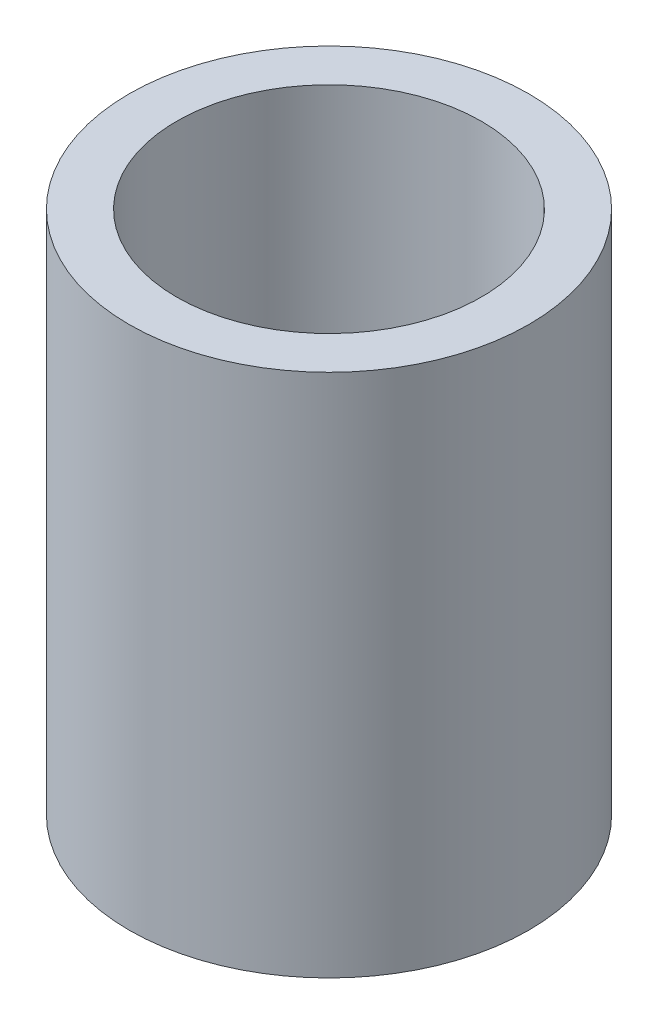
ISO-10303-21;
HEADER;
FILE_DESCRIPTION(('STEP AP214'),'2;1');
FILE_NAME('part.step','',(''),(''),'','','');
FILE_SCHEMA(('AUTOMOTIVE_DESIGN { 1 0 10303 214 1 1 1 1 }'));
ENDSEC;
DATA;
#1=APPLICATION_CONTEXT('core data for automotive mechanical design processes');
#2=APPLICATION_PROTOCOL_DEFINITION('international standard','automotive_design',2000,#1);
#3=PRODUCT_CONTEXT('',#1,'mechanical');
#4=PRODUCT('Part','Part','',(#3));
#5=PRODUCT_RELATED_PRODUCT_CATEGORY('part','',(#4));
#6=PRODUCT_DEFINITION_FORMATION('','',#4);
#7=PRODUCT_DEFINITION_CONTEXT('part definition',#1,'design');
#8=PRODUCT_DEFINITION('design','',#6,#7);
#9=PRODUCT_DEFINITION_SHAPE('','',#8);
#10=(LENGTH_UNIT() NAMED_UNIT(*) SI_UNIT(.MILLI.,.METRE.));
#11=(NAMED_UNIT(*) PLANE_ANGLE_UNIT() SI_UNIT($,.RADIAN.));
#12=(NAMED_UNIT(*) SI_UNIT($,.STERADIAN.) SOLID_ANGLE_UNIT());
#13=UNCERTAINTY_MEASURE_WITH_UNIT(LENGTH_MEASURE(1.E-05),#10,'distance_accuracy_value','');
#14=(GEOMETRIC_REPRESENTATION_CONTEXT(3) GLOBAL_UNCERTAINTY_ASSIGNED_CONTEXT((#13)) GLOBAL_UNIT_ASSIGNED_CONTEXT((#10,
#11,#12)) REPRESENTATION_CONTEXT('',''));
#15=CARTESIAN_POINT('',(0.,0.,0.));
#16=DIRECTION('',(0.,0.,1.));
#17=DIRECTION('',(1.,0.,0.));
#18=AXIS2_PLACEMENT_3D('',#15,#16,#17);
#19=CARTESIAN_POINT('',(8.0056,0.005599999999959,8.0056));
#20=DIRECTION('',(0.,1.,0.));
#21=DIRECTION('',(0.,0.,1.));
#22=AXIS2_PLACEMENT_3D('',#19,#20,#21);
#23=CYLINDRICAL_SURFACE('',#22,6.1);
#24=CARTESIAN_POINT('',(8.0056,0.005600000000015,8.0056));
#25=DIRECTION('',(0.,1.,0.));
#26=DIRECTION('',(0.,0.,1.));
#27=AXIS2_PLACEMENT_3D('',#24,#25,#26);
#28=CIRCLE('',#27,6.1);
#29=CARTESIAN_POINT('',(8.0056,0.005600000000015,14.1056));
#30=VERTEX_POINT('',#29);
#31=EDGE_CURVE('E26',#30,#30,#28,.F.);
#32=ORIENTED_EDGE('',*,*,#31,.T.);
#33=EDGE_LOOP('',(#32));
#34=FACE_BOUND('',#33,.T.);
#35=CARTESIAN_POINT('',(8.0056,21.0056,8.0056));
#36=DIRECTION('',(0.,1.,0.));
#37=DIRECTION('',(0.,0.,1.));
#38=AXIS2_PLACEMENT_3D('',#35,#36,#37);
#39=CIRCLE('',#38,6.1);
#40=CARTESIAN_POINT('',(8.0056,21.0056,14.1056));
#41=VERTEX_POINT('',#40);
#42=EDGE_CURVE('E17',#41,#41,#39,.F.);
#43=ORIENTED_EDGE('',*,*,#42,.F.);
#44=EDGE_LOOP('',(#43));
#45=FACE_BOUND('',#44,.T.);
#46=ADVANCED_FACE('F14',(#34,#45),#23,.F.);
#47=CARTESIAN_POINT('',(8.0056,21.0056,8.0056));
#48=DIRECTION('',(0.,1.,0.));
#49=DIRECTION('',(0.,0.,1.));
#50=AXIS2_PLACEMENT_3D('',#47,#48,#49);
#51=PLANE('',#50);
#52=ORIENTED_EDGE('',*,*,#42,.T.);
#53=EDGE_LOOP('',(#52));
#54=FACE_BOUND('',#53,.T.);
#55=CARTESIAN_POINT('',(8.0056,21.0056,8.0056));
#56=DIRECTION('',(0.,1.,0.));
#57=DIRECTION('',(0.,0.,1.));
#58=AXIS2_PLACEMENT_3D('',#55,#56,#57);
#59=CIRCLE('',#58,8.);
#60=CARTESIAN_POINT('',(8.0056,21.0056,16.0056));
#61=VERTEX_POINT('',#60);
#62=EDGE_CURVE('E21',#61,#61,#59,.F.);
#63=ORIENTED_EDGE('',*,*,#62,.F.);
#64=EDGE_LOOP('',(#63));
#65=FACE_BOUND('',#64,.T.);
#66=ADVANCED_FACE('F34',(#54,#65),#51,.T.);
#67=CARTESIAN_POINT('',(8.0056,0.005599999999959,8.0056));
#68=DIRECTION('',(0.,1.,0.));
#69=DIRECTION('',(0.,0.,1.));
#70=AXIS2_PLACEMENT_3D('',#67,#68,#69);
#71=PLANE('',#70);
#72=ORIENTED_EDGE('',*,*,#31,.F.);
#73=EDGE_LOOP('',(#72));
#74=FACE_BOUND('',#73,.T.);
#75=CARTESIAN_POINT('',(8.0056,0.005600000000015,8.0056));
#76=DIRECTION('',(0.,1.,0.));
#77=DIRECTION('',(0.,0.,1.));
#78=AXIS2_PLACEMENT_3D('',#75,#76,#77);
#79=CIRCLE('',#78,8.);
#80=CARTESIAN_POINT('',(8.0056,0.005600000000015,16.0056));
#81=VERTEX_POINT('',#80);
#82=EDGE_CURVE('E10',#81,#81,#79,.T.);
#83=ORIENTED_EDGE('',*,*,#82,.F.);
#84=EDGE_LOOP('',(#83));
#85=FACE_BOUND('',#84,.T.);
#86=ADVANCED_FACE('F42',(#74,#85),#71,.F.);
#87=CARTESIAN_POINT('',(8.0056,0.005599999999959,8.0056));
#88=DIRECTION('',(0.,1.,0.));
#89=DIRECTION('',(0.,0.,1.));
#90=AXIS2_PLACEMENT_3D('',#87,#88,#89);
#91=CYLINDRICAL_SURFACE('',#90,8.);
#92=ORIENTED_EDGE('',*,*,#82,.T.);
#93=EDGE_LOOP('',(#92));
#94=FACE_BOUND('',#93,.T.);
#95=ORIENTED_EDGE('',*,*,#62,.T.);
#96=EDGE_LOOP('',(#95));
#97=FACE_BOUND('',#96,.T.);
#98=ADVANCED_FACE('F43',(#94,#97),#91,.T.);
#99=CLOSED_SHELL('',(#46,#66,#86,#98));
#100=MANIFOLD_SOLID_BREP('B1',#99);
#101=ADVANCED_BREP_SHAPE_REPRESENTATION('',(#18,#100),#14);
#102=SHAPE_DEFINITION_REPRESENTATION(#9,#101);
ENDSEC;
END-ISO-10303-21;
